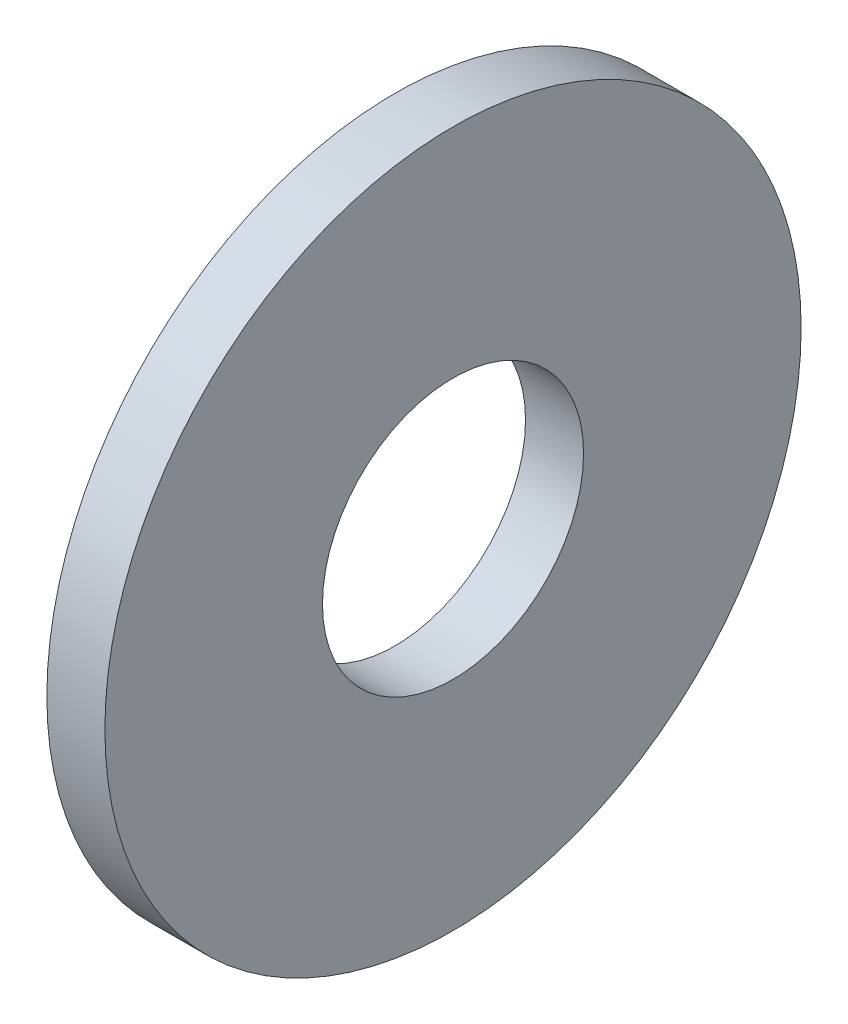
ISO-10303-21;
HEADER;
FILE_DESCRIPTION(('STEP AP214'),'2;1');
FILE_NAME('part.step','',(''),(''),'','','');
FILE_SCHEMA(('AUTOMOTIVE_DESIGN { 1 0 10303 214 1 1 1 1 }'));
ENDSEC;
DATA;
#1=APPLICATION_CONTEXT('core data for automotive mechanical design processes');
#2=APPLICATION_PROTOCOL_DEFINITION('international standard','automotive_design',2000,#1);
#3=PRODUCT_CONTEXT('',#1,'mechanical');
#4=PRODUCT('Part','Part','',(#3));
#5=PRODUCT_RELATED_PRODUCT_CATEGORY('part','',(#4));
#6=PRODUCT_DEFINITION_FORMATION('','',#4);
#7=PRODUCT_DEFINITION_CONTEXT('part definition',#1,'design');
#8=PRODUCT_DEFINITION('design','',#6,#7);
#9=PRODUCT_DEFINITION_SHAPE('','',#8);
#10=(LENGTH_UNIT() NAMED_UNIT(*) SI_UNIT(.MILLI.,.METRE.));
#11=(NAMED_UNIT(*) PLANE_ANGLE_UNIT() SI_UNIT($,.RADIAN.));
#12=(NAMED_UNIT(*) SI_UNIT($,.STERADIAN.) SOLID_ANGLE_UNIT());
#13=UNCERTAINTY_MEASURE_WITH_UNIT(LENGTH_MEASURE(1.E-05),#10,'distance_accuracy_value','');
#14=(GEOMETRIC_REPRESENTATION_CONTEXT(3) GLOBAL_UNCERTAINTY_ASSIGNED_CONTEXT((#13)) GLOBAL_UNIT_ASSIGNED_CONTEXT((#10,
#11,#12)) REPRESENTATION_CONTEXT('',''));
#15=CARTESIAN_POINT('',(0.,0.,0.));
#16=DIRECTION('',(0.,0.,1.));
#17=DIRECTION('',(1.,0.,0.));
#18=AXIS2_PLACEMENT_3D('',#15,#16,#17);
#19=CARTESIAN_POINT('',(3.175,0.,0.));
#20=DIRECTION('',(1.,0.,0.));
#21=DIRECTION('',(0.,0.,-1.));
#22=AXIS2_PLACEMENT_3D('',#19,#20,#21);
#23=PLANE('',#22);
#24=CARTESIAN_POINT('',(3.175,0.,0.));
#25=DIRECTION('',(1.,0.,0.));
#26=DIRECTION('',(0.,0.,-1.));
#27=AXIS2_PLACEMENT_3D('',#24,#25,#26);
#28=CIRCLE('',#27,38.1);
#29=CARTESIAN_POINT('',(3.175,0.,-38.1));
#30=VERTEX_POINT('',#29);
#31=EDGE_CURVE('E10',#30,#30,#28,.T.);
#32=ORIENTED_EDGE('',*,*,#31,.T.);
#33=EDGE_LOOP('',(#32));
#34=FACE_BOUND('',#33,.T.);
#35=CARTESIAN_POINT('',(3.175,0.,0.));
#36=DIRECTION('',(1.,0.,0.));
#37=DIRECTION('',(0.,0.,-1.));
#38=AXIS2_PLACEMENT_3D('',#35,#36,#37);
#39=CIRCLE('',#38,14.2875);
#40=CARTESIAN_POINT('',(3.175,0.,-14.2875));
#41=VERTEX_POINT('',#40);
#42=EDGE_CURVE('E44',#41,#41,#39,.T.);
#43=ORIENTED_EDGE('',*,*,#42,.F.);
#44=EDGE_LOOP('',(#43));
#45=FACE_BOUND('',#44,.T.);
#46=ADVANCED_FACE('F33',(#34,#45),#23,.T.);
#47=CARTESIAN_POINT('',(-3.175,0.,0.));
#48=DIRECTION('',(1.,0.,0.));
#49=DIRECTION('',(0.,0.,-1.));
#50=AXIS2_PLACEMENT_3D('',#47,#48,#49);
#51=PLANE('',#50);
#52=CARTESIAN_POINT('',(-3.175,0.,0.));
#53=DIRECTION('',(1.,0.,0.));
#54=DIRECTION('',(0.,0.,-1.));
#55=AXIS2_PLACEMENT_3D('',#52,#53,#54);
#56=CIRCLE('',#55,38.1);
#57=CARTESIAN_POINT('',(-3.175,0.,-38.1));
#58=VERTEX_POINT('',#57);
#59=EDGE_CURVE('E37',#58,#58,#56,.T.);
#60=ORIENTED_EDGE('',*,*,#59,.F.);
#61=EDGE_LOOP('',(#60));
#62=FACE_BOUND('',#61,.T.);
#63=CARTESIAN_POINT('',(-3.175,0.,0.));
#64=DIRECTION('',(1.,0.,0.));
#65=DIRECTION('',(0.,0.,-1.));
#66=AXIS2_PLACEMENT_3D('',#63,#64,#65);
#67=CIRCLE('',#66,14.2875);
#68=CARTESIAN_POINT('',(-3.175,0.,-14.2875));
#69=VERTEX_POINT('',#68);
#70=EDGE_CURVE('E46',#69,#69,#67,.T.);
#71=ORIENTED_EDGE('',*,*,#70,.T.);
#72=EDGE_LOOP('',(#71));
#73=FACE_BOUND('',#72,.T.);
#74=ADVANCED_FACE('F56',(#62,#73),#51,.F.);
#75=CARTESIAN_POINT('',(3.175,0.,0.));
#76=DIRECTION('',(-1.,0.,0.));
#77=DIRECTION('',(0.,0.,1.));
#78=AXIS2_PLACEMENT_3D('',#75,#76,#77);
#79=CYLINDRICAL_SURFACE('',#78,38.1);
#80=ORIENTED_EDGE('',*,*,#31,.F.);
#81=EDGE_LOOP('',(#80));
#82=FACE_BOUND('',#81,.T.);
#83=ORIENTED_EDGE('',*,*,#59,.T.);
#84=EDGE_LOOP('',(#83));
#85=FACE_BOUND('',#84,.T.);
#86=ADVANCED_FACE('F35',(#82,#85),#79,.T.);
#87=CARTESIAN_POINT('',(3.175,0.,0.));
#88=DIRECTION('',(-1.,0.,0.));
#89=DIRECTION('',(0.,0.,1.));
#90=AXIS2_PLACEMENT_3D('',#87,#88,#89);
#91=CYLINDRICAL_SURFACE('',#90,14.2875);
#92=ORIENTED_EDGE('',*,*,#42,.T.);
#93=EDGE_LOOP('',(#92));
#94=FACE_BOUND('',#93,.T.);
#95=ORIENTED_EDGE('',*,*,#70,.F.);
#96=EDGE_LOOP('',(#95));
#97=FACE_BOUND('',#96,.T.);
#98=ADVANCED_FACE('F52',(#94,#97),#91,.F.);
#99=CLOSED_SHELL('',(#46,#74,#86,#98));
#100=MANIFOLD_SOLID_BREP('B2',#99);
#101=ADVANCED_BREP_SHAPE_REPRESENTATION('',(#18,#100),#14);
#102=SHAPE_DEFINITION_REPRESENTATION(#9,#101);
ENDSEC;
END-ISO-10303-21;
